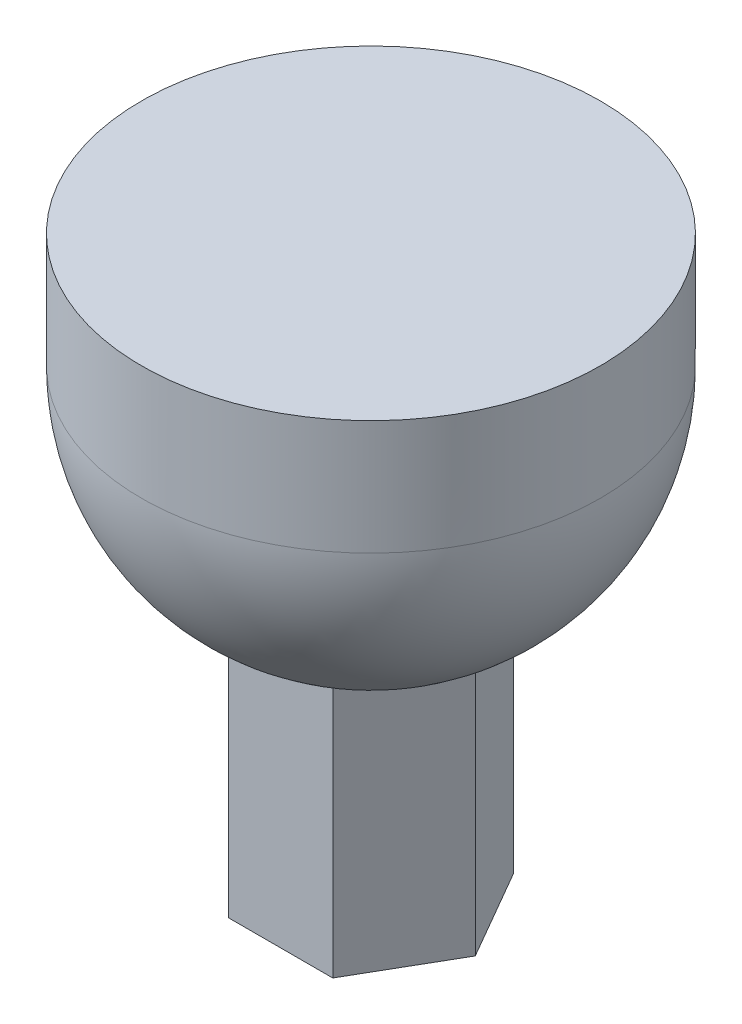
ISO-10303-21;
HEADER;
FILE_DESCRIPTION(('STEP AP214'),'2;1');
FILE_NAME('part.step','',(''),(''),'','','');
FILE_SCHEMA(('AUTOMOTIVE_DESIGN { 1 0 10303 214 1 1 1 1 }'));
ENDSEC;
DATA;
#1=APPLICATION_CONTEXT('core data for automotive mechanical design processes');
#2=APPLICATION_PROTOCOL_DEFINITION('international standard','automotive_design',2000,#1);
#3=PRODUCT_CONTEXT('',#1,'mechanical');
#4=PRODUCT('Part','Part','',(#3));
#5=PRODUCT_RELATED_PRODUCT_CATEGORY('part','',(#4));
#6=PRODUCT_DEFINITION_FORMATION('','',#4);
#7=PRODUCT_DEFINITION_CONTEXT('part definition',#1,'design');
#8=PRODUCT_DEFINITION('design','',#6,#7);
#9=PRODUCT_DEFINITION_SHAPE('','',#8);
#10=(LENGTH_UNIT() NAMED_UNIT(*) SI_UNIT(.MILLI.,.METRE.));
#11=(NAMED_UNIT(*) PLANE_ANGLE_UNIT() SI_UNIT($,.RADIAN.));
#12=(NAMED_UNIT(*) SI_UNIT($,.STERADIAN.) SOLID_ANGLE_UNIT());
#13=UNCERTAINTY_MEASURE_WITH_UNIT(LENGTH_MEASURE(1.E-05),#10,'distance_accuracy_value','');
#14=(GEOMETRIC_REPRESENTATION_CONTEXT(3) GLOBAL_UNCERTAINTY_ASSIGNED_CONTEXT((#13)) GLOBAL_UNIT_ASSIGNED_CONTEXT((#10,
#11,#12)) REPRESENTATION_CONTEXT('',''));
#15=CARTESIAN_POINT('',(0.,0.,0.));
#16=DIRECTION('',(0.,0.,1.));
#17=DIRECTION('',(1.,0.,0.));
#18=AXIS2_PLACEMENT_3D('',#15,#16,#17);
#19=CARTESIAN_POINT('',(0.,12.7,0.));
#20=DIRECTION('',(0.,1.,0.));
#21=DIRECTION('',(0.,0.,1.));
#22=AXIS2_PLACEMENT_3D('',#19,#20,#21);
#23=PLANE('',#22);
#24=CARTESIAN_POINT('',(0.,12.7,0.));
#25=DIRECTION('',(0.,-1.,0.));
#26=DIRECTION('',(0.,0.,-1.));
#27=AXIS2_PLACEMENT_3D('',#24,#25,#26);
#28=CIRCLE('',#27,25.4);
#29=CARTESIAN_POINT('',(0.,12.7,-25.4));
#30=VERTEX_POINT('',#29);
#31=EDGE_CURVE('E119',#30,#30,#28,.T.);
#32=ORIENTED_EDGE('',*,*,#31,.F.);
#33=EDGE_LOOP('',(#32));
#34=FACE_BOUND('',#33,.T.);
#35=ADVANCED_FACE('F34',(#34),#23,.T.);
#36=CARTESIAN_POINT('',(0.,0.,0.));
#37=DIRECTION('',(0.,-1.,0.));
#38=DIRECTION('',(1.,0.,0.));
#39=AXIS2_PLACEMENT_3D('',#36,#37,#38);
#40=SPHERICAL_SURFACE('',#39,25.4);
#41=CARTESIAN_POINT('',(-8.66025403784439,0.,5.));
#42=DIRECTION('',(-0.866025403784439,0.,0.5));
#43=DIRECTION('',(0.5,0.,0.866025403784439));
#44=AXIS2_PLACEMENT_3D('',#41,#42,#43);
#45=CIRCLE('',#44,23.3486616318795);
#46=CARTESIAN_POINT('',(-5.77350269189626,-22.6235865120159,10.));
#47=VERTEX_POINT('',#46);
#48=CARTESIAN_POINT('',(-11.5470053837925,-22.6235865120159,0.));
#49=VERTEX_POINT('',#48);
#50=EDGE_CURVE('E11',#47,#49,#45,.F.);
#51=ORIENTED_EDGE('',*,*,#50,.F.);
#52=CARTESIAN_POINT('',(0.,0.,10.));
#53=DIRECTION('',(0.,0.,1.));
#54=DIRECTION('',(1.,0.,0.));
#55=AXIS2_PLACEMENT_3D('',#52,#53,#54);
#56=CIRCLE('',#55,23.3486616318795);
#57=CARTESIAN_POINT('',(5.77350269189627,-22.6235865120159,10.));
#58=VERTEX_POINT('',#57);
#59=EDGE_CURVE('E88',#58,#47,#56,.F.);
#60=ORIENTED_EDGE('',*,*,#59,.F.);
#61=CARTESIAN_POINT('',(8.66025403784439,0.,5.));
#62=DIRECTION('',(0.866025403784439,0.,0.5));
#63=DIRECTION('',(0.5,0.,-0.866025403784439));
#64=AXIS2_PLACEMENT_3D('',#61,#62,#63);
#65=CIRCLE('',#64,23.3486616318795);
#66=CARTESIAN_POINT('',(11.5470053837925,-22.6235865120159,0.));
#67=VERTEX_POINT('',#66);
#68=EDGE_CURVE('E136',#67,#58,#65,.F.);
#69=ORIENTED_EDGE('',*,*,#68,.F.);
#70=CARTESIAN_POINT('',(8.66025403784439,0.,-5.));
#71=DIRECTION('',(0.866025403784438,0.,-0.5));
#72=DIRECTION('',(-0.5,0.,-0.866025403784439));
#73=AXIS2_PLACEMENT_3D('',#70,#71,#72);
#74=CIRCLE('',#73,23.3486616318795);
#75=CARTESIAN_POINT('',(5.77350269189626,-22.6235865120159,-10.));
#76=VERTEX_POINT('',#75);
#77=EDGE_CURVE('E139',#76,#67,#74,.F.);
#78=ORIENTED_EDGE('',*,*,#77,.F.);
#79=CARTESIAN_POINT('',(0.,0.,-10.));
#80=DIRECTION('',(0.,0.,-1.));
#81=DIRECTION('',(-1.,0.,0.));
#82=AXIS2_PLACEMENT_3D('',#79,#80,#81);
#83=CIRCLE('',#82,23.3486616318795);
#84=CARTESIAN_POINT('',(-5.77350269189625,-22.6235865120159,-10.));
#85=VERTEX_POINT('',#84);
#86=EDGE_CURVE('E51',#85,#76,#83,.F.);
#87=ORIENTED_EDGE('',*,*,#86,.F.);
#88=CARTESIAN_POINT('',(-8.66025403784439,0.,-5.));
#89=DIRECTION('',(-0.866025403784439,0.,-0.5));
#90=DIRECTION('',(-0.5,0.,0.866025403784439));
#91=AXIS2_PLACEMENT_3D('',#88,#89,#90);
#92=CIRCLE('',#91,23.3486616318795);
#93=EDGE_CURVE('E41',#49,#85,#92,.F.);
#94=ORIENTED_EDGE('',*,*,#93,.F.);
#95=EDGE_LOOP('',(#51,#60,#69,#78,#87,#94));
#96=FACE_BOUND('',#95,.T.);
#97=CARTESIAN_POINT('',(0.,0.,0.));
#98=DIRECTION('',(0.,-1.,0.));
#99=DIRECTION('',(0.,0.,-1.));
#100=AXIS2_PLACEMENT_3D('',#97,#98,#99);
#101=CIRCLE('',#100,25.4);
#102=CARTESIAN_POINT('',(0.,0.,-25.4));
#103=VERTEX_POINT('',#102);
#104=EDGE_CURVE('E132',#103,#103,#101,.T.);
#105=ORIENTED_EDGE('',*,*,#104,.T.);
#106=EDGE_LOOP('',(#105));
#107=FACE_BOUND('',#106,.T.);
#108=ADVANCED_FACE('F151',(#96,#107),#40,.T.);
#109=CARTESIAN_POINT('',(0.,-50.,0.));
#110=DIRECTION('',(0.,-1.,0.));
#111=DIRECTION('',(0.,0.,-1.));
#112=AXIS2_PLACEMENT_3D('',#109,#110,#111);
#113=CYLINDRICAL_SURFACE('',#112,25.4);
#114=ORIENTED_EDGE('',*,*,#31,.T.);
#115=EDGE_LOOP('',(#114));
#116=FACE_BOUND('',#115,.T.);
#117=ORIENTED_EDGE('',*,*,#104,.F.);
#118=EDGE_LOOP('',(#117));
#119=FACE_BOUND('',#118,.T.);
#120=ADVANCED_FACE('F154',(#116,#119),#113,.T.);
#121=CARTESIAN_POINT('',(-11.5470053837925,-50.8,0.));
#122=DIRECTION('',(-0.866025403784439,0.,0.5));
#123=DIRECTION('',(0.5,0.,0.866025403784439));
#124=AXIS2_PLACEMENT_3D('',#121,#122,#123);
#125=PLANE('',#124);
#126=DIRECTION('',(0.,1.,0.));
#127=VECTOR('',#126,1.);
#128=CARTESIAN_POINT('',(-5.77350269189626,-50.8,10.));
#129=LINE('',#128,#127);
#130=CARTESIAN_POINT('',(-5.77350269189626,-50.8,10.));
#131=VERTEX_POINT('',#130);
#132=EDGE_CURVE('E83',#131,#47,#129,.T.);
#133=ORIENTED_EDGE('',*,*,#132,.T.);
#134=ORIENTED_EDGE('',*,*,#50,.T.);
#135=DIRECTION('',(0.,1.,0.));
#136=VECTOR('',#135,1.);
#137=CARTESIAN_POINT('',(-11.5470053837925,-50.8,0.));
#138=LINE('',#137,#136);
#139=CARTESIAN_POINT('',(-11.5470053837925,-50.8,0.));
#140=VERTEX_POINT('',#139);
#141=EDGE_CURVE('E107',#140,#49,#138,.T.);
#142=ORIENTED_EDGE('',*,*,#141,.F.);
#143=DIRECTION('',(0.5,0.,0.866025403784439));
#144=VECTOR('',#143,1.);
#145=CARTESIAN_POINT('',(-11.5470053837925,-50.8,0.));
#146=LINE('',#145,#144);
#147=EDGE_CURVE('E99',#140,#131,#146,.T.);
#148=ORIENTED_EDGE('',*,*,#147,.T.);
#149=EDGE_LOOP('',(#133,#134,#142,#148));
#150=FACE_BOUND('',#149,.T.);
#151=ADVANCED_FACE('F105',(#150),#125,.T.);
#152=CARTESIAN_POINT('',(-5.77350269189625,-50.8,-10.));
#153=DIRECTION('',(-0.866025403784439,0.,-0.5));
#154=DIRECTION('',(-0.5,0.,0.866025403784439));
#155=AXIS2_PLACEMENT_3D('',#152,#153,#154);
#156=PLANE('',#155);
#157=ORIENTED_EDGE('',*,*,#141,.T.);
#158=ORIENTED_EDGE('',*,*,#93,.T.);
#159=DIRECTION('',(0.,1.,0.));
#160=VECTOR('',#159,1.);
#161=CARTESIAN_POINT('',(-5.77350269189625,-50.8,-10.));
#162=LINE('',#161,#160);
#163=CARTESIAN_POINT('',(-5.77350269189625,-50.8,-10.));
#164=VERTEX_POINT('',#163);
#165=EDGE_CURVE('E120',#164,#85,#162,.T.);
#166=ORIENTED_EDGE('',*,*,#165,.F.);
#167=DIRECTION('',(-0.5,0.,0.866025403784439));
#168=VECTOR('',#167,1.);
#169=CARTESIAN_POINT('',(-5.77350269189625,-50.8,-10.));
#170=LINE('',#169,#168);
#171=EDGE_CURVE('E92',#164,#140,#170,.T.);
#172=ORIENTED_EDGE('',*,*,#171,.T.);
#173=EDGE_LOOP('',(#157,#158,#166,#172));
#174=FACE_BOUND('',#173,.T.);
#175=ADVANCED_FACE('F143',(#174),#156,.T.);
#176=CARTESIAN_POINT('',(5.77350269189626,-50.8,-10.));
#177=DIRECTION('',(0.,0.,-1.));
#178=DIRECTION('',(-1.,0.,0.));
#179=AXIS2_PLACEMENT_3D('',#176,#177,#178);
#180=PLANE('',#179);
#181=ORIENTED_EDGE('',*,*,#165,.T.);
#182=ORIENTED_EDGE('',*,*,#86,.T.);
#183=DIRECTION('',(0.,1.,0.));
#184=VECTOR('',#183,1.);
#185=CARTESIAN_POINT('',(5.77350269189626,-50.8,-10.));
#186=LINE('',#185,#184);
#187=CARTESIAN_POINT('',(5.77350269189626,-50.8,-10.));
#188=VERTEX_POINT('',#187);
#189=EDGE_CURVE('E123',#188,#76,#186,.T.);
#190=ORIENTED_EDGE('',*,*,#189,.F.);
#191=DIRECTION('',(-1.,0.,0.));
#192=VECTOR('',#191,1.);
#193=CARTESIAN_POINT('',(5.77350269189626,-50.8,-10.));
#194=LINE('',#193,#192);
#195=EDGE_CURVE('E114',#188,#164,#194,.T.);
#196=ORIENTED_EDGE('',*,*,#195,.T.);
#197=EDGE_LOOP('',(#181,#182,#190,#196));
#198=FACE_BOUND('',#197,.T.);
#199=ADVANCED_FACE('F145',(#198),#180,.T.);
#200=CARTESIAN_POINT('',(11.5470053837925,-50.8,0.));
#201=DIRECTION('',(0.866025403784438,0.,-0.5));
#202=DIRECTION('',(-0.5,0.,-0.866025403784439));
#203=AXIS2_PLACEMENT_3D('',#200,#201,#202);
#204=PLANE('',#203);
#205=ORIENTED_EDGE('',*,*,#189,.T.);
#206=ORIENTED_EDGE('',*,*,#77,.T.);
#207=DIRECTION('',(0.,1.,0.));
#208=VECTOR('',#207,1.);
#209=CARTESIAN_POINT('',(11.5470053837925,-50.8,0.));
#210=LINE('',#209,#208);
#211=CARTESIAN_POINT('',(11.5470053837925,-50.8,0.));
#212=VERTEX_POINT('',#211);
#213=EDGE_CURVE('E126',#212,#67,#210,.T.);
#214=ORIENTED_EDGE('',*,*,#213,.F.);
#215=DIRECTION('',(-0.5,0.,-0.866025403784438));
#216=VECTOR('',#215,1.);
#217=CARTESIAN_POINT('',(11.5470053837925,-50.8,0.));
#218=LINE('',#217,#216);
#219=EDGE_CURVE('E111',#212,#188,#218,.T.);
#220=ORIENTED_EDGE('',*,*,#219,.T.);
#221=EDGE_LOOP('',(#205,#206,#214,#220));
#222=FACE_BOUND('',#221,.T.);
#223=ADVANCED_FACE('F148',(#222),#204,.T.);
#224=CARTESIAN_POINT('',(5.77350269189627,-50.8,10.));
#225=DIRECTION('',(0.866025403784439,0.,0.5));
#226=DIRECTION('',(0.5,0.,-0.866025403784439));
#227=AXIS2_PLACEMENT_3D('',#224,#225,#226);
#228=PLANE('',#227);
#229=ORIENTED_EDGE('',*,*,#213,.T.);
#230=ORIENTED_EDGE('',*,*,#68,.T.);
#231=DIRECTION('',(0.,1.,0.));
#232=VECTOR('',#231,1.);
#233=CARTESIAN_POINT('',(5.77350269189627,-50.8,10.));
#234=LINE('',#233,#232);
#235=CARTESIAN_POINT('',(5.77350269189627,-50.8,10.));
#236=VERTEX_POINT('',#235);
#237=EDGE_CURVE('E91',#236,#58,#234,.T.);
#238=ORIENTED_EDGE('',*,*,#237,.F.);
#239=DIRECTION('',(0.5,0.,-0.866025403784439));
#240=VECTOR('',#239,1.);
#241=CARTESIAN_POINT('',(5.77350269189627,-50.8,10.));
#242=LINE('',#241,#240);
#243=EDGE_CURVE('E103',#236,#212,#242,.T.);
#244=ORIENTED_EDGE('',*,*,#243,.T.);
#245=EDGE_LOOP('',(#229,#230,#238,#244));
#246=FACE_BOUND('',#245,.T.);
#247=ADVANCED_FACE('F150',(#246),#228,.T.);
#248=CARTESIAN_POINT('',(-5.77350269189626,-50.8,10.));
#249=DIRECTION('',(0.,0.,1.));
#250=DIRECTION('',(1.,0.,0.));
#251=AXIS2_PLACEMENT_3D('',#248,#249,#250);
#252=PLANE('',#251);
#253=ORIENTED_EDGE('',*,*,#237,.T.);
#254=ORIENTED_EDGE('',*,*,#59,.T.);
#255=ORIENTED_EDGE('',*,*,#132,.F.);
#256=DIRECTION('',(1.,0.,0.));
#257=VECTOR('',#256,1.);
#258=CARTESIAN_POINT('',(-5.77350269189626,-50.8,10.));
#259=LINE('',#258,#257);
#260=EDGE_CURVE('E87',#131,#236,#259,.T.);
#261=ORIENTED_EDGE('',*,*,#260,.T.);
#262=EDGE_LOOP('',(#253,#254,#255,#261));
#263=FACE_BOUND('',#262,.T.);
#264=ADVANCED_FACE('F86',(#263),#252,.T.);
#265=CARTESIAN_POINT('',(0.,-50.8,0.));
#266=DIRECTION('',(0.,1.,0.));
#267=DIRECTION('',(0.,0.,1.));
#268=AXIS2_PLACEMENT_3D('',#265,#266,#267);
#269=PLANE('',#268);
#270=ORIENTED_EDGE('',*,*,#147,.F.);
#271=ORIENTED_EDGE('',*,*,#171,.F.);
#272=ORIENTED_EDGE('',*,*,#195,.F.);
#273=ORIENTED_EDGE('',*,*,#219,.F.);
#274=ORIENTED_EDGE('',*,*,#243,.F.);
#275=ORIENTED_EDGE('',*,*,#260,.F.);
#276=EDGE_LOOP('',(#270,#271,#272,#273,#274,#275));
#277=FACE_BOUND('',#276,.T.);
#278=ADVANCED_FACE('F97',(#277),#269,.F.);
#279=CLOSED_SHELL('',(#35,#108,#120,#151,#175,#199,#223,#247,#264,#278));
#280=MANIFOLD_SOLID_BREP('B2',#279);
#281=ADVANCED_BREP_SHAPE_REPRESENTATION('',(#18,#280),#14);
#282=SHAPE_DEFINITION_REPRESENTATION(#9,#281);
ENDSEC;
END-ISO-10303-21;
